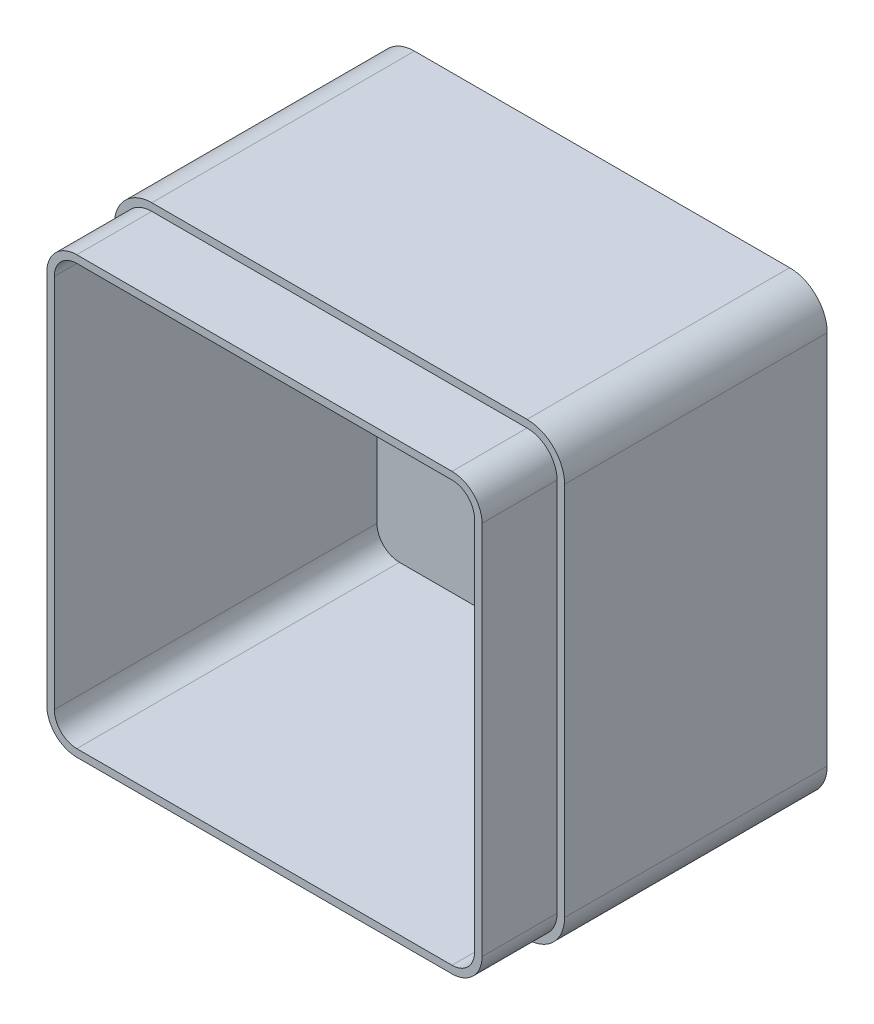
ISO-10303-21;
HEADER;
FILE_DESCRIPTION(('STEP AP214'),'2;1');
FILE_NAME('part.step','',(''),(''),'','','');
FILE_SCHEMA(('AUTOMOTIVE_DESIGN { 1 0 10303 214 1 1 1 1 }'));
ENDSEC;
DATA;
#1=APPLICATION_CONTEXT('core data for automotive mechanical design processes');
#2=APPLICATION_PROTOCOL_DEFINITION('international standard','automotive_design',2000,#1);
#3=PRODUCT_CONTEXT('',#1,'mechanical');
#4=PRODUCT('Part','Part','',(#3));
#5=PRODUCT_RELATED_PRODUCT_CATEGORY('part','',(#4));
#6=PRODUCT_DEFINITION_FORMATION('','',#4);
#7=PRODUCT_DEFINITION_CONTEXT('part definition',#1,'design');
#8=PRODUCT_DEFINITION('design','',#6,#7);
#9=PRODUCT_DEFINITION_SHAPE('','',#8);
#10=(LENGTH_UNIT() NAMED_UNIT(*) SI_UNIT(.MILLI.,.METRE.));
#11=(NAMED_UNIT(*) PLANE_ANGLE_UNIT() SI_UNIT($,.RADIAN.));
#12=(NAMED_UNIT(*) SI_UNIT($,.STERADIAN.) SOLID_ANGLE_UNIT());
#13=UNCERTAINTY_MEASURE_WITH_UNIT(LENGTH_MEASURE(1.E-05),#10,'distance_accuracy_value','');
#14=(GEOMETRIC_REPRESENTATION_CONTEXT(3) GLOBAL_UNCERTAINTY_ASSIGNED_CONTEXT((#13)) GLOBAL_UNIT_ASSIGNED_CONTEXT((#10,
#11,#12)) REPRESENTATION_CONTEXT('',''));
#15=CARTESIAN_POINT('',(0.,0.,0.));
#16=DIRECTION('',(0.,0.,1.));
#17=DIRECTION('',(1.,0.,0.));
#18=AXIS2_PLACEMENT_3D('',#15,#16,#17);
#19=CARTESIAN_POINT('',(0.,0.,90.));
#20=DIRECTION('',(0.,0.,-1.));
#21=DIRECTION('',(-1.,0.,0.));
#22=AXIS2_PLACEMENT_3D('',#19,#20,#21);
#23=PLANE('',#22);
#24=DIRECTION('',(-1.,0.,0.));
#25=VECTOR('',#24,1.);
#26=CARTESIAN_POINT('',(0.,116.,90.));
#27=LINE('',#26,#25);
#28=CARTESIAN_POINT('',(110.,116.,90.));
#29=VERTEX_POINT('',#28);
#30=CARTESIAN_POINT('',(9.99999999999996,116.,90.));
#31=VERTEX_POINT('',#30);
#32=EDGE_CURVE('E333',#29,#31,#27,.T.);
#33=ORIENTED_EDGE('',*,*,#32,.F.);
#34=CARTESIAN_POINT('',(110.,110.,90.));
#35=DIRECTION('',(0.,0.,-1.));
#36=DIRECTION('',(-1.,0.,0.));
#37=AXIS2_PLACEMENT_3D('',#34,#35,#36);
#38=CIRCLE('',#37,6.);
#39=CARTESIAN_POINT('',(116.,110.,90.));
#40=VERTEX_POINT('',#39);
#41=EDGE_CURVE('E381',#40,#29,#38,.F.);
#42=ORIENTED_EDGE('',*,*,#41,.F.);
#43=DIRECTION('',(0.,1.,0.));
#44=VECTOR('',#43,1.);
#45=CARTESIAN_POINT('',(116.,0.,90.));
#46=LINE('',#45,#44);
#47=CARTESIAN_POINT('',(116.,10.,90.));
#48=VERTEX_POINT('',#47);
#49=EDGE_CURVE('E393',#48,#40,#46,.T.);
#50=ORIENTED_EDGE('',*,*,#49,.F.);
#51=CARTESIAN_POINT('',(110.,10.,90.));
#52=DIRECTION('',(0.,0.,-1.));
#53=DIRECTION('',(-1.,0.,0.));
#54=AXIS2_PLACEMENT_3D('',#51,#52,#53);
#55=CIRCLE('',#54,6.);
#56=CARTESIAN_POINT('',(110.,4.,90.));
#57=VERTEX_POINT('',#56);
#58=EDGE_CURVE('E389',#57,#48,#55,.F.);
#59=ORIENTED_EDGE('',*,*,#58,.F.);
#60=DIRECTION('',(1.,0.,0.));
#61=VECTOR('',#60,1.);
#62=CARTESIAN_POINT('',(0.,4.,90.));
#63=LINE('',#62,#61);
#64=CARTESIAN_POINT('',(9.99999999999999,4.,90.));
#65=VERTEX_POINT('',#64);
#66=EDGE_CURVE('E385',#65,#57,#63,.T.);
#67=ORIENTED_EDGE('',*,*,#66,.F.);
#68=CARTESIAN_POINT('',(9.99999999999999,10.,90.));
#69=DIRECTION('',(0.,0.,-1.));
#70=DIRECTION('',(-1.,0.,0.));
#71=AXIS2_PLACEMENT_3D('',#68,#69,#70);
#72=CIRCLE('',#71,6.);
#73=CARTESIAN_POINT('',(4.,10.,90.));
#74=VERTEX_POINT('',#73);
#75=EDGE_CURVE('E386',#74,#65,#72,.F.);
#76=ORIENTED_EDGE('',*,*,#75,.F.);
#77=DIRECTION('',(0.,-1.,0.));
#78=VECTOR('',#77,1.);
#79=CARTESIAN_POINT('',(4.,0.,90.));
#80=LINE('',#79,#78);
#81=CARTESIAN_POINT('',(3.99999999999996,110.,90.));
#82=VERTEX_POINT('',#81);
#83=EDGE_CURVE('E343',#82,#74,#80,.T.);
#84=ORIENTED_EDGE('',*,*,#83,.F.);
#85=CARTESIAN_POINT('',(9.99999999999996,110.,90.));
#86=DIRECTION('',(0.,0.,-1.));
#87=DIRECTION('',(-1.,0.,0.));
#88=AXIS2_PLACEMENT_3D('',#85,#86,#87);
#89=CIRCLE('',#88,6.);
#90=EDGE_CURVE('E366',#31,#82,#89,.F.);
#91=ORIENTED_EDGE('',*,*,#90,.F.);
#92=EDGE_LOOP('',(#33,#42,#50,#59,#67,#76,#84,#91));
#93=FACE_BOUND('',#92,.T.);
#94=CARTESIAN_POINT('',(110.,110.,90.));
#95=DIRECTION('',(0.,0.,1.));
#96=DIRECTION('',(1.,0.,0.));
#97=AXIS2_PLACEMENT_3D('',#94,#95,#96);
#98=CIRCLE('',#97,8.00000000000001);
#99=CARTESIAN_POINT('',(118.,110.,90.));
#100=VERTEX_POINT('',#99);
#101=CARTESIAN_POINT('',(110.,118.,90.));
#102=VERTEX_POINT('',#101);
#103=EDGE_CURVE('E256',#100,#102,#98,.T.);
#104=ORIENTED_EDGE('',*,*,#103,.T.);
#105=DIRECTION('',(-1.,0.,0.));
#106=VECTOR('',#105,1.);
#107=CARTESIAN_POINT('',(110.,118.,90.));
#108=LINE('',#107,#106);
#109=CARTESIAN_POINT('',(9.99999999999995,118.,90.));
#110=VERTEX_POINT('',#109);
#111=EDGE_CURVE('E206',#102,#110,#108,.T.);
#112=ORIENTED_EDGE('',*,*,#111,.T.);
#113=CARTESIAN_POINT('',(9.99999999999996,110.,90.));
#114=DIRECTION('',(0.,0.,1.));
#115=DIRECTION('',(1.,0.,0.));
#116=AXIS2_PLACEMENT_3D('',#113,#114,#115);
#117=CIRCLE('',#116,7.99999999999999);
#118=CARTESIAN_POINT('',(1.99999999999997,110.,90.));
#119=VERTEX_POINT('',#118);
#120=EDGE_CURVE('E55',#110,#119,#117,.T.);
#121=ORIENTED_EDGE('',*,*,#120,.T.);
#122=DIRECTION('',(0.,-1.,0.));
#123=VECTOR('',#122,1.);
#124=CARTESIAN_POINT('',(1.99999999999996,110.,90.));
#125=LINE('',#124,#123);
#126=CARTESIAN_POINT('',(1.99999999999996,9.99999999999999,90.));
#127=VERTEX_POINT('',#126);
#128=EDGE_CURVE('E263',#119,#127,#125,.T.);
#129=ORIENTED_EDGE('',*,*,#128,.T.);
#130=CARTESIAN_POINT('',(9.99999999999999,10.,90.));
#131=DIRECTION('',(0.,0.,1.));
#132=DIRECTION('',(1.,0.,0.));
#133=AXIS2_PLACEMENT_3D('',#130,#131,#132);
#134=CIRCLE('',#133,8.00000000000001);
#135=CARTESIAN_POINT('',(9.99999999999999,1.99999999999998,90.));
#136=VERTEX_POINT('',#135);
#137=EDGE_CURVE('E267',#127,#136,#134,.T.);
#138=ORIENTED_EDGE('',*,*,#137,.T.);
#139=DIRECTION('',(1.,0.,0.));
#140=VECTOR('',#139,1.);
#141=CARTESIAN_POINT('',(9.99999999999999,2.,90.));
#142=LINE('',#141,#140);
#143=CARTESIAN_POINT('',(110.,2.,90.));
#144=VERTEX_POINT('',#143);
#145=EDGE_CURVE('E271',#136,#144,#142,.T.);
#146=ORIENTED_EDGE('',*,*,#145,.T.);
#147=CARTESIAN_POINT('',(110.,10.,90.));
#148=DIRECTION('',(0.,0.,1.));
#149=DIRECTION('',(1.,0.,0.));
#150=AXIS2_PLACEMENT_3D('',#147,#148,#149);
#151=CIRCLE('',#150,7.99999999999999);
#152=CARTESIAN_POINT('',(118.,10.,90.));
#153=VERTEX_POINT('',#152);
#154=EDGE_CURVE('E233',#144,#153,#151,.T.);
#155=ORIENTED_EDGE('',*,*,#154,.T.);
#156=DIRECTION('',(0.,1.,0.));
#157=VECTOR('',#156,1.);
#158=CARTESIAN_POINT('',(118.,9.99999999999999,90.));
#159=LINE('',#158,#157);
#160=EDGE_CURVE('E229',#153,#100,#159,.T.);
#161=ORIENTED_EDGE('',*,*,#160,.T.);
#162=EDGE_LOOP('',(#104,#112,#121,#129,#138,#146,#155,#161));
#163=FACE_BOUND('',#162,.T.);
#164=ADVANCED_FACE('F39',(#93,#163),#23,.F.);
#165=CARTESIAN_POINT('',(4.,0.,90.));
#166=DIRECTION('',(1.,0.,0.));
#167=DIRECTION('',(0.,1.,0.));
#168=AXIS2_PLACEMENT_3D('',#165,#166,#167);
#169=PLANE('',#168);
#170=ORIENTED_EDGE('',*,*,#83,.T.);
#171=DIRECTION('',(0.,0.,1.));
#172=VECTOR('',#171,1.);
#173=CARTESIAN_POINT('',(4.,10.,90.));
#174=LINE('',#173,#172);
#175=CARTESIAN_POINT('',(4.,10.,4.));
#176=VERTEX_POINT('',#175);
#177=EDGE_CURVE('E326',#176,#74,#174,.T.);
#178=ORIENTED_EDGE('',*,*,#177,.F.);
#179=DIRECTION('',(0.,-1.,0.));
#180=VECTOR('',#179,1.);
#181=CARTESIAN_POINT('',(4.,0.,4.));
#182=LINE('',#181,#180);
#183=CARTESIAN_POINT('',(3.99999999999996,110.,4.));
#184=VERTEX_POINT('',#183);
#185=EDGE_CURVE('E320',#184,#176,#182,.T.);
#186=ORIENTED_EDGE('',*,*,#185,.F.);
#187=DIRECTION('',(0.,0.,1.));
#188=VECTOR('',#187,1.);
#189=CARTESIAN_POINT('',(3.99999999999996,110.,90.));
#190=LINE('',#189,#188);
#191=EDGE_CURVE('E321',#82,#184,#190,.F.);
#192=ORIENTED_EDGE('',*,*,#191,.F.);
#193=EDGE_LOOP('',(#170,#178,#186,#192));
#194=FACE_BOUND('',#193,.T.);
#195=ADVANCED_FACE('F505',(#194),#169,.T.);
#196=CARTESIAN_POINT('',(0.,4.,90.));
#197=DIRECTION('',(0.,1.,0.));
#198=DIRECTION('',(0.,0.,1.));
#199=AXIS2_PLACEMENT_3D('',#196,#197,#198);
#200=PLANE('',#199);
#201=ORIENTED_EDGE('',*,*,#66,.T.);
#202=DIRECTION('',(0.,0.,1.));
#203=VECTOR('',#202,1.);
#204=CARTESIAN_POINT('',(110.,4.,90.));
#205=LINE('',#204,#203);
#206=CARTESIAN_POINT('',(110.,4.,4.));
#207=VERTEX_POINT('',#206);
#208=EDGE_CURVE('E363',#207,#57,#205,.T.);
#209=ORIENTED_EDGE('',*,*,#208,.F.);
#210=DIRECTION('',(1.,0.,0.));
#211=VECTOR('',#210,1.);
#212=CARTESIAN_POINT('',(0.,4.,4.));
#213=LINE('',#212,#211);
#214=CARTESIAN_POINT('',(9.99999999999999,4.,4.));
#215=VERTEX_POINT('',#214);
#216=EDGE_CURVE('E330',#215,#207,#213,.T.);
#217=ORIENTED_EDGE('',*,*,#216,.F.);
#218=DIRECTION('',(0.,0.,1.));
#219=VECTOR('',#218,1.);
#220=CARTESIAN_POINT('',(9.99999999999999,4.,90.));
#221=LINE('',#220,#219);
#222=EDGE_CURVE('E358',#65,#215,#221,.F.);
#223=ORIENTED_EDGE('',*,*,#222,.F.);
#224=EDGE_LOOP('',(#201,#209,#217,#223));
#225=FACE_BOUND('',#224,.T.);
#226=ADVANCED_FACE('F510',(#225),#200,.T.);
#227=CARTESIAN_POINT('',(116.,0.,90.));
#228=DIRECTION('',(-1.,0.,0.));
#229=DIRECTION('',(0.,-1.,0.));
#230=AXIS2_PLACEMENT_3D('',#227,#228,#229);
#231=PLANE('',#230);
#232=ORIENTED_EDGE('',*,*,#49,.T.);
#233=DIRECTION('',(0.,0.,1.));
#234=VECTOR('',#233,1.);
#235=CARTESIAN_POINT('',(116.,110.,90.));
#236=LINE('',#235,#234);
#237=CARTESIAN_POINT('',(116.,110.,4.));
#238=VERTEX_POINT('',#237);
#239=EDGE_CURVE('E362',#238,#40,#236,.T.);
#240=ORIENTED_EDGE('',*,*,#239,.F.);
#241=DIRECTION('',(0.,1.,0.));
#242=VECTOR('',#241,1.);
#243=CARTESIAN_POINT('',(116.,0.,4.));
#244=LINE('',#243,#242);
#245=CARTESIAN_POINT('',(116.,10.,4.));
#246=VERTEX_POINT('',#245);
#247=EDGE_CURVE('E344',#246,#238,#244,.T.);
#248=ORIENTED_EDGE('',*,*,#247,.F.);
#249=DIRECTION('',(0.,0.,1.));
#250=VECTOR('',#249,1.);
#251=CARTESIAN_POINT('',(116.,10.,90.));
#252=LINE('',#251,#250);
#253=EDGE_CURVE('E367',#48,#246,#252,.F.);
#254=ORIENTED_EDGE('',*,*,#253,.F.);
#255=EDGE_LOOP('',(#232,#240,#248,#254));
#256=FACE_BOUND('',#255,.T.);
#257=ADVANCED_FACE('F539',(#256),#231,.T.);
#258=CARTESIAN_POINT('',(0.,116.,90.));
#259=DIRECTION('',(0.,-1.,0.));
#260=DIRECTION('',(0.,0.,-1.));
#261=AXIS2_PLACEMENT_3D('',#258,#259,#260);
#262=PLANE('',#261);
#263=DIRECTION('',(-1.,0.,0.));
#264=VECTOR('',#263,1.);
#265=CARTESIAN_POINT('',(0.,116.,4.));
#266=LINE('',#265,#264);
#267=CARTESIAN_POINT('',(110.,116.,4.));
#268=VERTEX_POINT('',#267);
#269=CARTESIAN_POINT('',(9.99999999999996,116.,4.));
#270=VERTEX_POINT('',#269);
#271=EDGE_CURVE('E339',#268,#270,#266,.T.);
#272=ORIENTED_EDGE('',*,*,#271,.F.);
#273=DIRECTION('',(0.,0.,-1.));
#274=VECTOR('',#273,1.);
#275=CARTESIAN_POINT('',(110.,116.,90.));
#276=LINE('',#275,#274);
#277=EDGE_CURVE('E337',#29,#268,#276,.T.);
#278=ORIENTED_EDGE('',*,*,#277,.F.);
#279=ORIENTED_EDGE('',*,*,#32,.T.);
#280=DIRECTION('',(0.,0.,-1.));
#281=VECTOR('',#280,1.);
#282=CARTESIAN_POINT('',(9.99999999999996,116.,90.));
#283=LINE('',#282,#281);
#284=EDGE_CURVE('E378',#270,#31,#283,.F.);
#285=ORIENTED_EDGE('',*,*,#284,.F.);
#286=EDGE_LOOP('',(#272,#278,#279,#285));
#287=FACE_BOUND('',#286,.T.);
#288=ADVANCED_FACE('F535',(#287),#262,.T.);
#289=CARTESIAN_POINT('',(0.,0.,4.));
#290=DIRECTION('',(0.,0.,-1.));
#291=DIRECTION('',(-1.,0.,0.));
#292=AXIS2_PLACEMENT_3D('',#289,#290,#291);
#293=PLANE('',#292);
#294=ORIENTED_EDGE('',*,*,#185,.T.);
#295=CARTESIAN_POINT('',(9.99999999999999,10.,4.));
#296=DIRECTION('',(0.,0.,-1.));
#297=DIRECTION('',(-1.,0.,0.));
#298=AXIS2_PLACEMENT_3D('',#295,#296,#297);
#299=CIRCLE('',#298,6.);
#300=EDGE_CURVE('E338',#215,#176,#299,.T.);
#301=ORIENTED_EDGE('',*,*,#300,.F.);
#302=ORIENTED_EDGE('',*,*,#216,.T.);
#303=CARTESIAN_POINT('',(110.,10.,4.));
#304=DIRECTION('',(0.,0.,-1.));
#305=DIRECTION('',(-1.,0.,0.));
#306=AXIS2_PLACEMENT_3D('',#303,#304,#305);
#307=CIRCLE('',#306,6.);
#308=EDGE_CURVE('E347',#246,#207,#307,.T.);
#309=ORIENTED_EDGE('',*,*,#308,.F.);
#310=ORIENTED_EDGE('',*,*,#247,.T.);
#311=CARTESIAN_POINT('',(110.,110.,4.));
#312=DIRECTION('',(0.,0.,-1.));
#313=DIRECTION('',(-1.,0.,0.));
#314=AXIS2_PLACEMENT_3D('',#311,#312,#313);
#315=CIRCLE('',#314,6.);
#316=EDGE_CURVE('E325',#268,#238,#315,.T.);
#317=ORIENTED_EDGE('',*,*,#316,.F.);
#318=ORIENTED_EDGE('',*,*,#271,.T.);
#319=CARTESIAN_POINT('',(9.99999999999996,110.,4.));
#320=DIRECTION('',(0.,0.,-1.));
#321=DIRECTION('',(-1.,0.,0.));
#322=AXIS2_PLACEMENT_3D('',#319,#320,#321);
#323=CIRCLE('',#322,6.);
#324=EDGE_CURVE('E334',#184,#270,#323,.T.);
#325=ORIENTED_EDGE('',*,*,#324,.F.);
#326=EDGE_LOOP('',(#294,#301,#302,#309,#310,#317,#318,#325));
#327=FACE_BOUND('',#326,.T.);
#328=ADVANCED_FACE('F531',(#327),#293,.F.);
#329=CARTESIAN_POINT('',(9.99999999999996,110.,90.));
#330=DIRECTION('',(0.,0.,-1.));
#331=DIRECTION('',(-1.,0.,0.));
#332=AXIS2_PLACEMENT_3D('',#329,#330,#331);
#333=CYLINDRICAL_SURFACE('',#332,6.);
#334=ORIENTED_EDGE('',*,*,#90,.T.);
#335=ORIENTED_EDGE('',*,*,#191,.T.);
#336=ORIENTED_EDGE('',*,*,#324,.T.);
#337=ORIENTED_EDGE('',*,*,#284,.T.);
#338=EDGE_LOOP('',(#334,#335,#336,#337));
#339=FACE_BOUND('',#338,.T.);
#340=ADVANCED_FACE('F527',(#339),#333,.F.);
#341=CARTESIAN_POINT('',(9.99999999999999,10.,90.));
#342=DIRECTION('',(0.,0.,-1.));
#343=DIRECTION('',(-1.,0.,0.));
#344=AXIS2_PLACEMENT_3D('',#341,#342,#343);
#345=CYLINDRICAL_SURFACE('',#344,6.);
#346=ORIENTED_EDGE('',*,*,#75,.T.);
#347=ORIENTED_EDGE('',*,*,#222,.T.);
#348=ORIENTED_EDGE('',*,*,#300,.T.);
#349=ORIENTED_EDGE('',*,*,#177,.T.);
#350=EDGE_LOOP('',(#346,#347,#348,#349));
#351=FACE_BOUND('',#350,.T.);
#352=ADVANCED_FACE('F523',(#351),#345,.F.);
#353=CARTESIAN_POINT('',(110.,10.,90.));
#354=DIRECTION('',(0.,0.,-1.));
#355=DIRECTION('',(-1.,0.,0.));
#356=AXIS2_PLACEMENT_3D('',#353,#354,#355);
#357=CYLINDRICAL_SURFACE('',#356,6.);
#358=ORIENTED_EDGE('',*,*,#58,.T.);
#359=ORIENTED_EDGE('',*,*,#253,.T.);
#360=ORIENTED_EDGE('',*,*,#308,.T.);
#361=ORIENTED_EDGE('',*,*,#208,.T.);
#362=EDGE_LOOP('',(#358,#359,#360,#361));
#363=FACE_BOUND('',#362,.T.);
#364=ADVANCED_FACE('F519',(#363),#357,.F.);
#365=CARTESIAN_POINT('',(110.,110.,90.));
#366=DIRECTION('',(0.,0.,-1.));
#367=DIRECTION('',(-1.,0.,0.));
#368=AXIS2_PLACEMENT_3D('',#365,#366,#367);
#369=CYLINDRICAL_SURFACE('',#368,6.);
#370=ORIENTED_EDGE('',*,*,#41,.T.);
#371=ORIENTED_EDGE('',*,*,#277,.T.);
#372=ORIENTED_EDGE('',*,*,#316,.T.);
#373=ORIENTED_EDGE('',*,*,#239,.T.);
#374=EDGE_LOOP('',(#370,#371,#372,#373));
#375=FACE_BOUND('',#374,.T.);
#376=ADVANCED_FACE('F516',(#375),#369,.F.);
#377=CARTESIAN_POINT('',(110.,110.,70.));
#378=DIRECTION('',(0.,0.,1.));
#379=DIRECTION('',(1.,0.,0.));
#380=AXIS2_PLACEMENT_3D('',#377,#378,#379);
#381=PLANE('',#380);
#382=DIRECTION('',(0.,1.,0.));
#383=VECTOR('',#382,1.);
#384=CARTESIAN_POINT('',(118.,9.99999999999999,70.));
#385=LINE('',#384,#383);
#386=CARTESIAN_POINT('',(118.,10.,70.));
#387=VERTEX_POINT('',#386);
#388=CARTESIAN_POINT('',(118.,110.,70.));
#389=VERTEX_POINT('',#388);
#390=EDGE_CURVE('E213',#387,#389,#385,.T.);
#391=ORIENTED_EDGE('',*,*,#390,.F.);
#392=CARTESIAN_POINT('',(110.,10.,70.));
#393=DIRECTION('',(0.,0.,1.));
#394=DIRECTION('',(1.,0.,0.));
#395=AXIS2_PLACEMENT_3D('',#392,#393,#394);
#396=CIRCLE('',#395,7.99999999999999);
#397=CARTESIAN_POINT('',(110.,2.,70.));
#398=VERTEX_POINT('',#397);
#399=EDGE_CURVE('E250',#398,#387,#396,.T.);
#400=ORIENTED_EDGE('',*,*,#399,.F.);
#401=DIRECTION('',(1.,0.,0.));
#402=VECTOR('',#401,1.);
#403=CARTESIAN_POINT('',(9.99999999999999,2.,70.));
#404=LINE('',#403,#402);
#405=CARTESIAN_POINT('',(9.99999999999999,1.99999999999998,70.));
#406=VERTEX_POINT('',#405);
#407=EDGE_CURVE('E246',#406,#398,#404,.T.);
#408=ORIENTED_EDGE('',*,*,#407,.F.);
#409=CARTESIAN_POINT('',(9.99999999999999,10.,70.));
#410=DIRECTION('',(0.,0.,1.));
#411=DIRECTION('',(1.,0.,0.));
#412=AXIS2_PLACEMENT_3D('',#409,#410,#411);
#413=CIRCLE('',#412,8.00000000000001);
#414=CARTESIAN_POINT('',(1.99999999999996,9.99999999999999,70.));
#415=VERTEX_POINT('',#414);
#416=EDGE_CURVE('E242',#415,#406,#413,.T.);
#417=ORIENTED_EDGE('',*,*,#416,.F.);
#418=DIRECTION('',(0.,-1.,0.));
#419=VECTOR('',#418,1.);
#420=CARTESIAN_POINT('',(1.99999999999996,110.,70.));
#421=LINE('',#420,#419);
#422=CARTESIAN_POINT('',(1.99999999999997,110.,70.));
#423=VERTEX_POINT('',#422);
#424=EDGE_CURVE('E238',#423,#415,#421,.T.);
#425=ORIENTED_EDGE('',*,*,#424,.F.);
#426=CARTESIAN_POINT('',(9.99999999999996,110.,70.));
#427=DIRECTION('',(0.,0.,1.));
#428=DIRECTION('',(1.,0.,0.));
#429=AXIS2_PLACEMENT_3D('',#426,#427,#428);
#430=CIRCLE('',#429,7.99999999999999);
#431=CARTESIAN_POINT('',(9.99999999999995,118.,70.));
#432=VERTEX_POINT('',#431);
#433=EDGE_CURVE('E223',#432,#423,#430,.T.);
#434=ORIENTED_EDGE('',*,*,#433,.F.);
#435=DIRECTION('',(-1.,0.,0.));
#436=VECTOR('',#435,1.);
#437=CARTESIAN_POINT('',(110.,118.,70.));
#438=LINE('',#437,#436);
#439=CARTESIAN_POINT('',(110.,118.,70.));
#440=VERTEX_POINT('',#439);
#441=EDGE_CURVE('E204',#440,#432,#438,.T.);
#442=ORIENTED_EDGE('',*,*,#441,.F.);
#443=CARTESIAN_POINT('',(110.,110.,70.));
#444=DIRECTION('',(0.,0.,1.));
#445=DIRECTION('',(1.,0.,0.));
#446=AXIS2_PLACEMENT_3D('',#443,#444,#445);
#447=CIRCLE('',#446,8.00000000000001);
#448=EDGE_CURVE('E219',#389,#440,#447,.T.);
#449=ORIENTED_EDGE('',*,*,#448,.F.);
#450=EDGE_LOOP('',(#391,#400,#408,#417,#425,#434,#442,#449));
#451=FACE_BOUND('',#450,.T.);
#452=CARTESIAN_POINT('',(110.,110.,70.));
#453=DIRECTION('',(0.,0.,1.));
#454=DIRECTION('',(1.,0.,0.));
#455=AXIS2_PLACEMENT_3D('',#452,#453,#454);
#456=CIRCLE('',#455,9.99999999999999);
#457=CARTESIAN_POINT('',(120.,110.,70.));
#458=VERTEX_POINT('',#457);
#459=CARTESIAN_POINT('',(110.,120.,70.));
#460=VERTEX_POINT('',#459);
#461=EDGE_CURVE('E280',#458,#460,#456,.T.);
#462=ORIENTED_EDGE('',*,*,#461,.T.);
#463=DIRECTION('',(-1.,0.,0.));
#464=VECTOR('',#463,1.);
#465=CARTESIAN_POINT('',(110.,120.,70.));
#466=LINE('',#465,#464);
#467=CARTESIAN_POINT('',(9.99999999999996,120.,70.));
#468=VERTEX_POINT('',#467);
#469=EDGE_CURVE('E300',#460,#468,#466,.T.);
#470=ORIENTED_EDGE('',*,*,#469,.T.);
#471=CARTESIAN_POINT('',(9.99999999999996,110.,70.));
#472=DIRECTION('',(0.,0.,1.));
#473=DIRECTION('',(1.,0.,0.));
#474=AXIS2_PLACEMENT_3D('',#471,#472,#473);
#475=CIRCLE('',#474,9.99999999999999);
#476=CARTESIAN_POINT('',(0.,110.,70.));
#477=VERTEX_POINT('',#476);
#478=EDGE_CURVE('E303',#468,#477,#475,.T.);
#479=ORIENTED_EDGE('',*,*,#478,.T.);
#480=DIRECTION('',(0.,-1.,0.));
#481=VECTOR('',#480,1.);
#482=CARTESIAN_POINT('',(0.,110.,70.));
#483=LINE('',#482,#481);
#484=CARTESIAN_POINT('',(0.,9.99999999999999,70.));
#485=VERTEX_POINT('',#484);
#486=EDGE_CURVE('E306',#477,#485,#483,.T.);
#487=ORIENTED_EDGE('',*,*,#486,.T.);
#488=CARTESIAN_POINT('',(9.99999999999999,10.,70.));
#489=DIRECTION('',(0.,0.,1.));
#490=DIRECTION('',(1.,0.,0.));
#491=AXIS2_PLACEMENT_3D('',#488,#489,#490);
#492=CIRCLE('',#491,10.);
#493=CARTESIAN_POINT('',(9.99999999999999,0.,70.));
#494=VERTEX_POINT('',#493);
#495=EDGE_CURVE('E309',#485,#494,#492,.T.);
#496=ORIENTED_EDGE('',*,*,#495,.T.);
#497=DIRECTION('',(1.,0.,0.));
#498=VECTOR('',#497,1.);
#499=CARTESIAN_POINT('',(9.99999999999999,0.,70.));
#500=LINE('',#499,#498);
#501=CARTESIAN_POINT('',(110.,0.,70.));
#502=VERTEX_POINT('',#501);
#503=EDGE_CURVE('E312',#494,#502,#500,.T.);
#504=ORIENTED_EDGE('',*,*,#503,.T.);
#505=CARTESIAN_POINT('',(110.,10.,70.));
#506=DIRECTION('',(0.,0.,1.));
#507=DIRECTION('',(1.,0.,0.));
#508=AXIS2_PLACEMENT_3D('',#505,#506,#507);
#509=CIRCLE('',#508,9.99999999999999);
#510=CARTESIAN_POINT('',(120.,10.,70.));
#511=VERTEX_POINT('',#510);
#512=EDGE_CURVE('E315',#502,#511,#509,.T.);
#513=ORIENTED_EDGE('',*,*,#512,.T.);
#514=DIRECTION('',(0.,1.,0.));
#515=VECTOR('',#514,1.);
#516=CARTESIAN_POINT('',(120.,10.,70.));
#517=LINE('',#516,#515);
#518=EDGE_CURVE('E63',#511,#458,#517,.T.);
#519=ORIENTED_EDGE('',*,*,#518,.T.);
#520=EDGE_LOOP('',(#462,#470,#479,#487,#496,#504,#513,#519));
#521=FACE_BOUND('',#520,.T.);
#522=ADVANCED_FACE('F218',(#451,#521),#381,.T.);
#523=CARTESIAN_POINT('',(110.,110.,70.));
#524=DIRECTION('',(0.,0.,1.));
#525=DIRECTION('',(1.,0.,0.));
#526=AXIS2_PLACEMENT_3D('',#523,#524,#525);
#527=CYLINDRICAL_SURFACE('',#526,8.00000000000001);
#528=ORIENTED_EDGE('',*,*,#103,.F.);
#529=DIRECTION('',(0.,0.,1.));
#530=VECTOR('',#529,1.);
#531=CARTESIAN_POINT('',(118.,110.,70.));
#532=LINE('',#531,#530);
#533=EDGE_CURVE('E227',#389,#100,#532,.T.);
#534=ORIENTED_EDGE('',*,*,#533,.F.);
#535=ORIENTED_EDGE('',*,*,#448,.T.);
#536=DIRECTION('',(0.,0.,1.));
#537=VECTOR('',#536,1.);
#538=CARTESIAN_POINT('',(110.,118.,70.));
#539=LINE('',#538,#537);
#540=EDGE_CURVE('E201',#440,#102,#539,.T.);
#541=ORIENTED_EDGE('',*,*,#540,.T.);
#542=EDGE_LOOP('',(#528,#534,#535,#541));
#543=FACE_BOUND('',#542,.T.);
#544=ADVANCED_FACE('F226',(#543),#527,.T.);
#545=CARTESIAN_POINT('',(118.,9.99999999999999,70.));
#546=DIRECTION('',(1.,0.,0.));
#547=DIRECTION('',(0.,0.,-1.));
#548=AXIS2_PLACEMENT_3D('',#545,#546,#547);
#549=PLANE('',#548);
#550=ORIENTED_EDGE('',*,*,#160,.F.);
#551=DIRECTION('',(0.,0.,1.));
#552=VECTOR('',#551,1.);
#553=CARTESIAN_POINT('',(118.,10.,70.));
#554=LINE('',#553,#552);
#555=EDGE_CURVE('E281',#387,#153,#554,.T.);
#556=ORIENTED_EDGE('',*,*,#555,.F.);
#557=ORIENTED_EDGE('',*,*,#390,.T.);
#558=ORIENTED_EDGE('',*,*,#533,.T.);
#559=EDGE_LOOP('',(#550,#556,#557,#558));
#560=FACE_BOUND('',#559,.T.);
#561=ADVANCED_FACE('F550',(#560),#549,.T.);
#562=CARTESIAN_POINT('',(110.,10.,70.));
#563=DIRECTION('',(0.,0.,1.));
#564=DIRECTION('',(1.,0.,0.));
#565=AXIS2_PLACEMENT_3D('',#562,#563,#564);
#566=CYLINDRICAL_SURFACE('',#565,7.99999999999999);
#567=ORIENTED_EDGE('',*,*,#154,.F.);
#568=DIRECTION('',(0.,0.,1.));
#569=VECTOR('',#568,1.);
#570=CARTESIAN_POINT('',(110.,2.,70.));
#571=LINE('',#570,#569);
#572=EDGE_CURVE('E284',#398,#144,#571,.T.);
#573=ORIENTED_EDGE('',*,*,#572,.F.);
#574=ORIENTED_EDGE('',*,*,#399,.T.);
#575=ORIENTED_EDGE('',*,*,#555,.T.);
#576=EDGE_LOOP('',(#567,#573,#574,#575));
#577=FACE_BOUND('',#576,.T.);
#578=ADVANCED_FACE('F565',(#577),#566,.T.);
#579=CARTESIAN_POINT('',(9.99999999999999,2.,70.));
#580=DIRECTION('',(0.,-1.,0.));
#581=DIRECTION('',(0.,0.,-1.));
#582=AXIS2_PLACEMENT_3D('',#579,#580,#581);
#583=PLANE('',#582);
#584=ORIENTED_EDGE('',*,*,#145,.F.);
#585=DIRECTION('',(0.,0.,1.));
#586=VECTOR('',#585,1.);
#587=CARTESIAN_POINT('',(9.99999999999999,1.99999999999998,70.));
#588=LINE('',#587,#586);
#589=EDGE_CURVE('E287',#406,#136,#588,.T.);
#590=ORIENTED_EDGE('',*,*,#589,.F.);
#591=ORIENTED_EDGE('',*,*,#407,.T.);
#592=ORIENTED_EDGE('',*,*,#572,.T.);
#593=EDGE_LOOP('',(#584,#590,#591,#592));
#594=FACE_BOUND('',#593,.T.);
#595=ADVANCED_FACE('F561',(#594),#583,.T.);
#596=CARTESIAN_POINT('',(9.99999999999999,10.,70.));
#597=DIRECTION('',(0.,0.,1.));
#598=DIRECTION('',(1.,0.,0.));
#599=AXIS2_PLACEMENT_3D('',#596,#597,#598);
#600=CYLINDRICAL_SURFACE('',#599,8.00000000000001);
#601=ORIENTED_EDGE('',*,*,#137,.F.);
#602=DIRECTION('',(0.,0.,1.));
#603=VECTOR('',#602,1.);
#604=CARTESIAN_POINT('',(1.99999999999996,9.99999999999999,70.));
#605=LINE('',#604,#603);
#606=EDGE_CURVE('E290',#415,#127,#605,.T.);
#607=ORIENTED_EDGE('',*,*,#606,.F.);
#608=ORIENTED_EDGE('',*,*,#416,.T.);
#609=ORIENTED_EDGE('',*,*,#589,.T.);
#610=EDGE_LOOP('',(#601,#607,#608,#609));
#611=FACE_BOUND('',#610,.T.);
#612=ADVANCED_FACE('F557',(#611),#600,.T.);
#613=CARTESIAN_POINT('',(1.99999999999996,110.,70.));
#614=DIRECTION('',(-1.,0.,0.));
#615=DIRECTION('',(0.,-1.,0.));
#616=AXIS2_PLACEMENT_3D('',#613,#614,#615);
#617=PLANE('',#616);
#618=ORIENTED_EDGE('',*,*,#128,.F.);
#619=DIRECTION('',(0.,0.,1.));
#620=VECTOR('',#619,1.);
#621=CARTESIAN_POINT('',(1.99999999999997,110.,70.));
#622=LINE('',#621,#620);
#623=EDGE_CURVE('E293',#423,#119,#622,.T.);
#624=ORIENTED_EDGE('',*,*,#623,.F.);
#625=ORIENTED_EDGE('',*,*,#424,.T.);
#626=ORIENTED_EDGE('',*,*,#606,.T.);
#627=EDGE_LOOP('',(#618,#624,#625,#626));
#628=FACE_BOUND('',#627,.T.);
#629=ADVANCED_FACE('F554',(#628),#617,.T.);
#630=CARTESIAN_POINT('',(9.99999999999996,110.,70.));
#631=DIRECTION('',(0.,0.,1.));
#632=DIRECTION('',(1.,0.,0.));
#633=AXIS2_PLACEMENT_3D('',#630,#631,#632);
#634=CYLINDRICAL_SURFACE('',#633,7.99999999999999);
#635=ORIENTED_EDGE('',*,*,#120,.F.);
#636=DIRECTION('',(0.,0.,1.));
#637=VECTOR('',#636,1.);
#638=CARTESIAN_POINT('',(9.99999999999995,118.,70.));
#639=LINE('',#638,#637);
#640=EDGE_CURVE('E212',#432,#110,#639,.T.);
#641=ORIENTED_EDGE('',*,*,#640,.F.);
#642=ORIENTED_EDGE('',*,*,#433,.T.);
#643=ORIENTED_EDGE('',*,*,#623,.T.);
#644=EDGE_LOOP('',(#635,#641,#642,#643));
#645=FACE_BOUND('',#644,.T.);
#646=ADVANCED_FACE('F500',(#645),#634,.T.);
#647=CARTESIAN_POINT('',(110.,118.,70.));
#648=DIRECTION('',(0.,1.,0.));
#649=DIRECTION('',(0.,0.,1.));
#650=AXIS2_PLACEMENT_3D('',#647,#648,#649);
#651=PLANE('',#650);
#652=ORIENTED_EDGE('',*,*,#111,.F.);
#653=ORIENTED_EDGE('',*,*,#540,.F.);
#654=ORIENTED_EDGE('',*,*,#441,.T.);
#655=ORIENTED_EDGE('',*,*,#640,.T.);
#656=EDGE_LOOP('',(#652,#653,#654,#655));
#657=FACE_BOUND('',#656,.T.);
#658=ADVANCED_FACE('F203',(#657),#651,.T.);
#659=CARTESIAN_POINT('',(0.,0.,0.));
#660=DIRECTION('',(0.,0.,-1.));
#661=DIRECTION('',(-1.,0.,0.));
#662=AXIS2_PLACEMENT_3D('',#659,#660,#661);
#663=PLANE('',#662);
#664=DIRECTION('',(0.,-1.,0.));
#665=VECTOR('',#664,1.);
#666=CARTESIAN_POINT('',(0.,0.,0.));
#667=LINE('',#666,#665);
#668=CARTESIAN_POINT('',(0.,110.,0.));
#669=VERTEX_POINT('',#668);
#670=CARTESIAN_POINT('',(0.,9.99999999999999,0.));
#671=VERTEX_POINT('',#670);
#672=EDGE_CURVE('E371',#669,#671,#667,.T.);
#673=ORIENTED_EDGE('',*,*,#672,.F.);
#674=CARTESIAN_POINT('',(9.99999999999996,110.,0.));
#675=DIRECTION('',(0.,0.,-1.));
#676=DIRECTION('',(-1.,0.,0.));
#677=AXIS2_PLACEMENT_3D('',#674,#675,#676);
#678=CIRCLE('',#677,10.);
#679=CARTESIAN_POINT('',(9.99999999999996,120.,0.));
#680=VERTEX_POINT('',#679);
#681=EDGE_CURVE('E436',#669,#680,#678,.T.);
#682=ORIENTED_EDGE('',*,*,#681,.T.);
#683=DIRECTION('',(-1.,0.,0.));
#684=VECTOR('',#683,1.);
#685=CARTESIAN_POINT('',(0.,120.,0.));
#686=LINE('',#685,#684);
#687=CARTESIAN_POINT('',(110.,120.,0.));
#688=VERTEX_POINT('',#687);
#689=EDGE_CURVE('E416',#688,#680,#686,.T.);
#690=ORIENTED_EDGE('',*,*,#689,.F.);
#691=CARTESIAN_POINT('',(110.,110.,0.));
#692=DIRECTION('',(0.,0.,-1.));
#693=DIRECTION('',(-1.,0.,0.));
#694=AXIS2_PLACEMENT_3D('',#691,#692,#693);
#695=CIRCLE('',#694,10.);
#696=CARTESIAN_POINT('',(120.,110.,0.));
#697=VERTEX_POINT('',#696);
#698=EDGE_CURVE('E427',#688,#697,#695,.T.);
#699=ORIENTED_EDGE('',*,*,#698,.T.);
#700=DIRECTION('',(0.,1.,0.));
#701=VECTOR('',#700,1.);
#702=CARTESIAN_POINT('',(120.,0.,0.));
#703=LINE('',#702,#701);
#704=CARTESIAN_POINT('',(120.,10.,0.));
#705=VERTEX_POINT('',#704);
#706=EDGE_CURVE('E412',#705,#697,#703,.T.);
#707=ORIENTED_EDGE('',*,*,#706,.F.);
#708=CARTESIAN_POINT('',(110.,10.,0.));
#709=DIRECTION('',(0.,0.,-1.));
#710=DIRECTION('',(-1.,0.,0.));
#711=AXIS2_PLACEMENT_3D('',#708,#709,#710);
#712=CIRCLE('',#711,10.);
#713=CARTESIAN_POINT('',(110.,0.,0.));
#714=VERTEX_POINT('',#713);
#715=EDGE_CURVE('E430',#705,#714,#712,.T.);
#716=ORIENTED_EDGE('',*,*,#715,.T.);
#717=DIRECTION('',(1.,0.,0.));
#718=VECTOR('',#717,1.);
#719=CARTESIAN_POINT('',(0.,0.,0.));
#720=LINE('',#719,#718);
#721=CARTESIAN_POINT('',(9.99999999999999,0.,0.));
#722=VERTEX_POINT('',#721);
#723=EDGE_CURVE('E408',#722,#714,#720,.T.);
#724=ORIENTED_EDGE('',*,*,#723,.F.);
#725=CARTESIAN_POINT('',(9.99999999999999,10.,0.));
#726=DIRECTION('',(0.,0.,-1.));
#727=DIRECTION('',(-1.,0.,0.));
#728=AXIS2_PLACEMENT_3D('',#725,#726,#727);
#729=CIRCLE('',#728,10.);
#730=EDGE_CURVE('E433',#722,#671,#729,.T.);
#731=ORIENTED_EDGE('',*,*,#730,.T.);
#732=EDGE_LOOP('',(#673,#682,#690,#699,#707,#716,#724,#731));
#733=FACE_BOUND('',#732,.T.);
#734=ADVANCED_FACE('F492',(#733),#663,.T.);
#735=CARTESIAN_POINT('',(9.99999999999996,110.,90.));
#736=DIRECTION('',(0.,0.,-1.));
#737=DIRECTION('',(-1.,0.,0.));
#738=AXIS2_PLACEMENT_3D('',#735,#736,#737);
#739=CYLINDRICAL_SURFACE('',#738,10.);
#740=DIRECTION('',(0.,0.,-1.));
#741=VECTOR('',#740,1.);
#742=CARTESIAN_POINT('',(0.,110.,90.));
#743=LINE('',#742,#741);
#744=EDGE_CURVE('E424',#477,#669,#743,.T.);
#745=ORIENTED_EDGE('',*,*,#744,.F.);
#746=ORIENTED_EDGE('',*,*,#478,.F.);
#747=DIRECTION('',(0.,0.,-1.));
#748=VECTOR('',#747,1.);
#749=CARTESIAN_POINT('',(9.99999999999996,120.,90.));
#750=LINE('',#749,#748);
#751=EDGE_CURVE('E442',#680,#468,#750,.F.);
#752=ORIENTED_EDGE('',*,*,#751,.F.);
#753=ORIENTED_EDGE('',*,*,#681,.F.);
#754=EDGE_LOOP('',(#745,#746,#752,#753));
#755=FACE_BOUND('',#754,.T.);
#756=ADVANCED_FACE('F471',(#755),#739,.T.);
#757=CARTESIAN_POINT('',(110.,110.,90.));
#758=DIRECTION('',(0.,0.,-1.));
#759=DIRECTION('',(-1.,0.,0.));
#760=AXIS2_PLACEMENT_3D('',#757,#758,#759);
#761=CYLINDRICAL_SURFACE('',#760,10.);
#762=DIRECTION('',(0.,0.,-1.));
#763=VECTOR('',#762,1.);
#764=CARTESIAN_POINT('',(110.,120.,90.));
#765=LINE('',#764,#763);
#766=EDGE_CURVE('E439',#460,#688,#765,.T.);
#767=ORIENTED_EDGE('',*,*,#766,.F.);
#768=ORIENTED_EDGE('',*,*,#461,.F.);
#769=DIRECTION('',(0.,0.,-1.));
#770=VECTOR('',#769,1.);
#771=CARTESIAN_POINT('',(120.,110.,90.));
#772=LINE('',#771,#770);
#773=EDGE_CURVE('E48',#697,#458,#772,.F.);
#774=ORIENTED_EDGE('',*,*,#773,.F.);
#775=ORIENTED_EDGE('',*,*,#698,.F.);
#776=EDGE_LOOP('',(#767,#768,#774,#775));
#777=FACE_BOUND('',#776,.T.);
#778=ADVANCED_FACE('F41',(#777),#761,.T.);
#779=CARTESIAN_POINT('',(0.,120.,90.));
#780=DIRECTION('',(0.,-1.,0.));
#781=DIRECTION('',(0.,0.,-1.));
#782=AXIS2_PLACEMENT_3D('',#779,#780,#781);
#783=PLANE('',#782);
#784=ORIENTED_EDGE('',*,*,#469,.F.);
#785=ORIENTED_EDGE('',*,*,#766,.T.);
#786=ORIENTED_EDGE('',*,*,#689,.T.);
#787=ORIENTED_EDGE('',*,*,#751,.T.);
#788=EDGE_LOOP('',(#784,#785,#786,#787));
#789=FACE_BOUND('',#788,.T.);
#790=ADVANCED_FACE('F466',(#789),#783,.F.);
#791=CARTESIAN_POINT('',(110.,10.,90.));
#792=DIRECTION('',(0.,0.,-1.));
#793=DIRECTION('',(-1.,0.,0.));
#794=AXIS2_PLACEMENT_3D('',#791,#792,#793);
#795=CYLINDRICAL_SURFACE('',#794,10.);
#796=DIRECTION('',(0.,0.,-1.));
#797=VECTOR('',#796,1.);
#798=CARTESIAN_POINT('',(120.,10.,90.));
#799=LINE('',#798,#797);
#800=EDGE_CURVE('E11',#511,#705,#799,.T.);
#801=ORIENTED_EDGE('',*,*,#800,.F.);
#802=ORIENTED_EDGE('',*,*,#512,.F.);
#803=DIRECTION('',(0.,0.,-1.));
#804=VECTOR('',#803,1.);
#805=CARTESIAN_POINT('',(110.,0.,90.));
#806=LINE('',#805,#804);
#807=EDGE_CURVE('E446',#714,#502,#806,.F.);
#808=ORIENTED_EDGE('',*,*,#807,.F.);
#809=ORIENTED_EDGE('',*,*,#715,.F.);
#810=EDGE_LOOP('',(#801,#802,#808,#809));
#811=FACE_BOUND('',#810,.T.);
#812=ADVANCED_FACE('F490',(#811),#795,.T.);
#813=CARTESIAN_POINT('',(120.,0.,90.));
#814=DIRECTION('',(-1.,0.,0.));
#815=DIRECTION('',(0.,-1.,0.));
#816=AXIS2_PLACEMENT_3D('',#813,#814,#815);
#817=PLANE('',#816);
#818=ORIENTED_EDGE('',*,*,#518,.F.);
#819=ORIENTED_EDGE('',*,*,#800,.T.);
#820=ORIENTED_EDGE('',*,*,#706,.T.);
#821=ORIENTED_EDGE('',*,*,#773,.T.);
#822=EDGE_LOOP('',(#818,#819,#820,#821));
#823=FACE_BOUND('',#822,.T.);
#824=ADVANCED_FACE('F456',(#823),#817,.F.);
#825=CARTESIAN_POINT('',(9.99999999999999,10.,90.));
#826=DIRECTION('',(0.,0.,-1.));
#827=DIRECTION('',(-1.,0.,0.));
#828=AXIS2_PLACEMENT_3D('',#825,#826,#827);
#829=CYLINDRICAL_SURFACE('',#828,10.);
#830=DIRECTION('',(0.,0.,-1.));
#831=VECTOR('',#830,1.);
#832=CARTESIAN_POINT('',(9.99999999999999,0.,90.));
#833=LINE('',#832,#831);
#834=EDGE_CURVE('E450',#494,#722,#833,.T.);
#835=ORIENTED_EDGE('',*,*,#834,.F.);
#836=ORIENTED_EDGE('',*,*,#495,.F.);
#837=DIRECTION('',(0.,0.,-1.));
#838=VECTOR('',#837,1.);
#839=CARTESIAN_POINT('',(0.,9.99999999999999,90.));
#840=LINE('',#839,#838);
#841=EDGE_CURVE('E420',#671,#485,#840,.F.);
#842=ORIENTED_EDGE('',*,*,#841,.F.);
#843=ORIENTED_EDGE('',*,*,#730,.F.);
#844=EDGE_LOOP('',(#835,#836,#842,#843));
#845=FACE_BOUND('',#844,.T.);
#846=ADVANCED_FACE('F481',(#845),#829,.T.);
#847=CARTESIAN_POINT('',(0.,0.,90.));
#848=DIRECTION('',(0.,1.,0.));
#849=DIRECTION('',(0.,0.,1.));
#850=AXIS2_PLACEMENT_3D('',#847,#848,#849);
#851=PLANE('',#850);
#852=ORIENTED_EDGE('',*,*,#503,.F.);
#853=ORIENTED_EDGE('',*,*,#834,.T.);
#854=ORIENTED_EDGE('',*,*,#723,.T.);
#855=ORIENTED_EDGE('',*,*,#807,.T.);
#856=EDGE_LOOP('',(#852,#853,#854,#855));
#857=FACE_BOUND('',#856,.T.);
#858=ADVANCED_FACE('F486',(#857),#851,.F.);
#859=CARTESIAN_POINT('',(0.,0.,90.));
#860=DIRECTION('',(1.,0.,0.));
#861=DIRECTION('',(0.,1.,0.));
#862=AXIS2_PLACEMENT_3D('',#859,#860,#861);
#863=PLANE('',#862);
#864=ORIENTED_EDGE('',*,*,#486,.F.);
#865=ORIENTED_EDGE('',*,*,#744,.T.);
#866=ORIENTED_EDGE('',*,*,#672,.T.);
#867=ORIENTED_EDGE('',*,*,#841,.T.);
#868=EDGE_LOOP('',(#864,#865,#866,#867));
#869=FACE_BOUND('',#868,.T.);
#870=ADVANCED_FACE('F476',(#869),#863,.F.);
#871=CLOSED_SHELL('',(#164,#195,#226,#257,#288,#328,#340,#352,#364,#376,#522,#544,#561,#578,
#595,#612,#629,#646,#658,#734,#756,#778,#790,#812,#824,#846,#858,#870));
#872=MANIFOLD_SOLID_BREP('B2',#871);
#873=ADVANCED_BREP_SHAPE_REPRESENTATION('',(#18,#872),#14);
#874=SHAPE_DEFINITION_REPRESENTATION(#9,#873);
ENDSEC;
END-ISO-10303-21;
